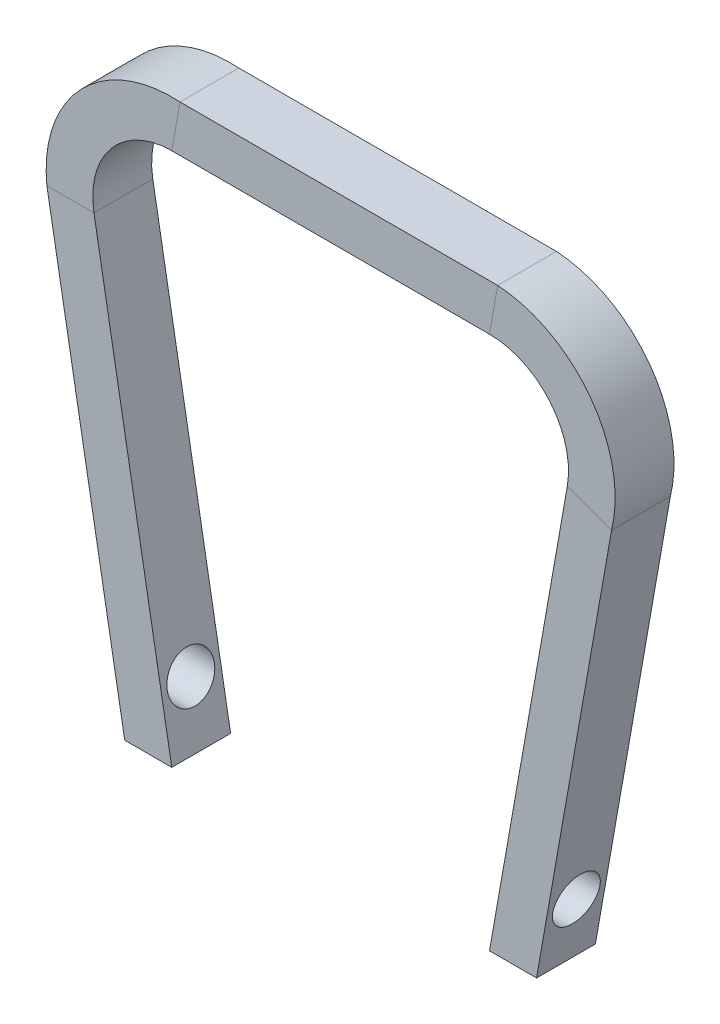
ISO-10303-21;
HEADER;
FILE_DESCRIPTION(('STEP AP214'),'2;1');
FILE_NAME('part.step','',(''),(''),'','','');
FILE_SCHEMA(('AUTOMOTIVE_DESIGN { 1 0 10303 214 1 1 1 1 }'));
ENDSEC;
DATA;
#1=APPLICATION_CONTEXT('core data for automotive mechanical design processes');
#2=APPLICATION_PROTOCOL_DEFINITION('international standard','automotive_design',2000,#1);
#3=PRODUCT_CONTEXT('',#1,'mechanical');
#4=PRODUCT('Part','Part','',(#3));
#5=PRODUCT_RELATED_PRODUCT_CATEGORY('part','',(#4));
#6=PRODUCT_DEFINITION_FORMATION('','',#4);
#7=PRODUCT_DEFINITION_CONTEXT('part definition',#1,'design');
#8=PRODUCT_DEFINITION('design','',#6,#7);
#9=PRODUCT_DEFINITION_SHAPE('','',#8);
#10=(LENGTH_UNIT() NAMED_UNIT(*) SI_UNIT(.MILLI.,.METRE.));
#11=(NAMED_UNIT(*) PLANE_ANGLE_UNIT() SI_UNIT($,.RADIAN.));
#12=(NAMED_UNIT(*) SI_UNIT($,.STERADIAN.) SOLID_ANGLE_UNIT());
#13=UNCERTAINTY_MEASURE_WITH_UNIT(LENGTH_MEASURE(1.E-05),#10,'distance_accuracy_value','');
#14=(GEOMETRIC_REPRESENTATION_CONTEXT(3) GLOBAL_UNCERTAINTY_ASSIGNED_CONTEXT((#13)) GLOBAL_UNIT_ASSIGNED_CONTEXT((#10,
#11,#12)) REPRESENTATION_CONTEXT('',''));
#15=CARTESIAN_POINT('',(0.,0.,0.));
#16=DIRECTION('',(0.,0.,1.));
#17=DIRECTION('',(1.,0.,0.));
#18=AXIS2_PLACEMENT_3D('',#15,#16,#17);
#19=CARTESIAN_POINT('',(78.1272770271848,-3.47492465618881,-6.35));
#20=DIRECTION('',(0.,0.,1.));
#21=DIRECTION('',(1.,0.,0.));
#22=AXIS2_PLACEMENT_3D('',#19,#20,#21);
#23=PLANE('',#22);
#24=DIRECTION('',(-1.,0.,0.));
#25=VECTOR('',#24,1.);
#26=CARTESIAN_POINT('',(68.58,0.,-6.35));
#27=LINE('',#26,#25);
#28=CARTESIAN_POINT('',(78.74,0.,-6.35));
#29=VERTEX_POINT('',#28);
#30=CARTESIAN_POINT('',(68.58,0.,-6.35));
#31=VERTEX_POINT('',#30);
#32=EDGE_CURVE('E130',#29,#31,#27,.T.);
#33=ORIENTED_EDGE('',*,*,#32,.T.);
#34=DIRECTION('',(0.173648177666931,0.984807753012208,0.));
#35=VECTOR('',#34,1.);
#36=CARTESIAN_POINT('',(68.58,0.,-6.35));
#37=LINE('',#36,#35);
#38=CARTESIAN_POINT('',(85.3751449124814,95.25,-6.35));
#39=VERTEX_POINT('',#38);
#40=EDGE_CURVE('E155',#31,#39,#37,.T.);
#41=ORIENTED_EDGE('',*,*,#40,.T.);
#42=DIRECTION('',(0.939692620785908,-0.342020143325671,0.));
#43=VECTOR('',#42,1.);
#44=CARTESIAN_POINT('',(94.9224219396662,91.7750753438112,-6.35));
#45=LINE('',#44,#43);
#46=CARTESIAN_POINT('',(94.9224219396662,91.7750753438112,-6.35));
#47=VERTEX_POINT('',#46);
#48=EDGE_CURVE('E151',#39,#47,#45,.T.);
#49=ORIENTED_EDGE('',*,*,#48,.T.);
#50=DIRECTION('',(0.173648177666931,0.984807753012208,0.));
#51=VECTOR('',#50,1.);
#52=CARTESIAN_POINT('',(78.1272770271848,-3.47492465618881,-6.35));
#53=LINE('',#52,#51);
#54=EDGE_CURVE('E144',#29,#47,#53,.T.);
#55=ORIENTED_EDGE('',*,*,#54,.F.);
#56=EDGE_LOOP('',(#33,#41,#49,#55));
#57=FACE_BOUND('',#56,.T.);
#58=ADVANCED_FACE('F42',(#57),#23,.F.);
#59=CARTESIAN_POINT('',(78.1272770271848,-3.47492465618881,6.35));
#60=DIRECTION('',(-0.984807753012208,0.173648177666931,0.));
#61=DIRECTION('',(-0.173648177666931,-0.984807753012208,0.));
#62=AXIS2_PLACEMENT_3D('',#59,#60,#61);
#63=PLANE('',#62);
#64=CARTESIAN_POINT('',(80.9793526549975,12.7,0.));
#65=DIRECTION('',(-0.984807753012208,0.173648177666931,0.));
#66=DIRECTION('',(0.173648177666931,0.984807753012208,0.));
#67=AXIS2_PLACEMENT_3D('',#64,#65,#66);
#68=ELLIPSE('',#67,5.17146675356125,5.092900553352);
#69=CARTESIAN_POINT('',(81.8773684326185,17.792900553352,0.));
#70=VERTEX_POINT('',#69);
#71=EDGE_CURVE('E147',#70,#70,#68,.T.);
#72=ORIENTED_EDGE('',*,*,#71,.T.);
#73=EDGE_LOOP('',(#72));
#74=FACE_BOUND('',#73,.T.);
#75=DIRECTION('',(0.,0.,-1.));
#76=VECTOR('',#75,1.);
#77=CARTESIAN_POINT('',(78.74,0.,6.35));
#78=LINE('',#77,#76);
#79=CARTESIAN_POINT('',(78.74,0.,6.35));
#80=VERTEX_POINT('',#79);
#81=EDGE_CURVE('E58',#80,#29,#78,.T.);
#82=ORIENTED_EDGE('',*,*,#81,.T.);
#83=ORIENTED_EDGE('',*,*,#54,.T.);
#84=DIRECTION('',(0.,0.,1.));
#85=VECTOR('',#84,1.);
#86=CARTESIAN_POINT('',(94.9224219396662,91.7750753438112,6.35));
#87=LINE('',#86,#85);
#88=CARTESIAN_POINT('',(94.9224219396662,91.7750753438112,6.35));
#89=VERTEX_POINT('',#88);
#90=EDGE_CURVE('E152',#47,#89,#87,.T.);
#91=ORIENTED_EDGE('',*,*,#90,.T.);
#92=DIRECTION('',(0.173648177666931,0.984807753012208,0.));
#93=VECTOR('',#92,1.);
#94=CARTESIAN_POINT('',(78.1272770271848,-3.47492465618881,6.35));
#95=LINE('',#94,#93);
#96=EDGE_CURVE('E146',#80,#89,#95,.T.);
#97=ORIENTED_EDGE('',*,*,#96,.F.);
#98=EDGE_LOOP('',(#82,#83,#91,#97));
#99=FACE_BOUND('',#98,.T.);
#100=ADVANCED_FACE('F142',(#74,#99),#63,.F.);
#101=CARTESIAN_POINT('',(78.1272770271848,-3.47492465618881,6.35));
#102=DIRECTION('',(0.,0.,-1.));
#103=DIRECTION('',(-1.,0.,0.));
#104=AXIS2_PLACEMENT_3D('',#101,#102,#103);
#105=PLANE('',#104);
#106=DIRECTION('',(1.,0.,0.));
#107=VECTOR('',#106,1.);
#108=CARTESIAN_POINT('',(68.58,0.,6.35));
#109=LINE('',#108,#107);
#110=CARTESIAN_POINT('',(68.58,0.,6.35));
#111=VERTEX_POINT('',#110);
#112=EDGE_CURVE('E138',#111,#80,#109,.T.);
#113=ORIENTED_EDGE('',*,*,#112,.T.);
#114=ORIENTED_EDGE('',*,*,#96,.T.);
#115=DIRECTION('',(-0.939692620785908,0.342020143325671,0.));
#116=VECTOR('',#115,1.);
#117=CARTESIAN_POINT('',(94.9224219396662,91.7750753438112,6.35));
#118=LINE('',#117,#116);
#119=CARTESIAN_POINT('',(85.3751449124814,95.25,6.35));
#120=VERTEX_POINT('',#119);
#121=EDGE_CURVE('E189',#89,#120,#118,.T.);
#122=ORIENTED_EDGE('',*,*,#121,.T.);
#123=DIRECTION('',(0.173648177666931,0.984807753012208,0.));
#124=VECTOR('',#123,1.);
#125=CARTESIAN_POINT('',(68.58,0.,6.35));
#126=LINE('',#125,#124);
#127=EDGE_CURVE('E253',#111,#120,#126,.T.);
#128=ORIENTED_EDGE('',*,*,#127,.F.);
#129=EDGE_LOOP('',(#113,#114,#122,#128));
#130=FACE_BOUND('',#129,.T.);
#131=ADVANCED_FACE('F296',(#130),#105,.F.);
#132=CARTESIAN_POINT('',(0.,0.,0.));
#133=DIRECTION('',(0.,-1.,0.));
#134=DIRECTION('',(0.,0.,-1.));
#135=AXIS2_PLACEMENT_3D('',#132,#133,#134);
#136=PLANE('',#135);
#137=DIRECTION('',(0.,0.,-1.));
#138=VECTOR('',#137,1.);
#139=CARTESIAN_POINT('',(0.,0.,6.35));
#140=LINE('',#139,#138);
#141=CARTESIAN_POINT('',(0.,0.,6.35));
#142=VERTEX_POINT('',#141);
#143=CARTESIAN_POINT('',(0.,0.,-6.35));
#144=VERTEX_POINT('',#143);
#145=EDGE_CURVE('E226',#142,#144,#140,.T.);
#146=ORIENTED_EDGE('',*,*,#145,.F.);
#147=DIRECTION('',(1.,0.,0.));
#148=VECTOR('',#147,1.);
#149=CARTESIAN_POINT('',(-10.16,0.,6.35));
#150=LINE('',#149,#148);
#151=CARTESIAN_POINT('',(-10.16,0.,6.35));
#152=VERTEX_POINT('',#151);
#153=EDGE_CURVE('E11',#152,#142,#150,.T.);
#154=ORIENTED_EDGE('',*,*,#153,.F.);
#155=DIRECTION('',(0.,0.,1.));
#156=VECTOR('',#155,1.);
#157=CARTESIAN_POINT('',(-10.16,0.,6.35));
#158=LINE('',#157,#156);
#159=CARTESIAN_POINT('',(-10.16,0.,-6.35));
#160=VERTEX_POINT('',#159);
#161=EDGE_CURVE('E66',#160,#152,#158,.T.);
#162=ORIENTED_EDGE('',*,*,#161,.F.);
#163=DIRECTION('',(-1.,0.,0.));
#164=VECTOR('',#163,1.);
#165=CARTESIAN_POINT('',(-10.16,0.,-6.35));
#166=LINE('',#165,#164);
#167=EDGE_CURVE('E183',#144,#160,#166,.T.);
#168=ORIENTED_EDGE('',*,*,#167,.F.);
#169=EDGE_LOOP('',(#146,#154,#162,#168));
#170=FACE_BOUND('',#169,.T.);
#171=ADVANCED_FACE('F44',(#170),#136,.T.);
#172=CARTESIAN_POINT('',(68.58,0.,6.35));
#173=DIRECTION('',(0.984807753012208,-0.173648177666931,0.));
#174=DIRECTION('',(0.173648177666931,0.984807753012208,0.));
#175=AXIS2_PLACEMENT_3D('',#172,#173,#174);
#176=PLANE('',#175);
#177=CARTESIAN_POINT('',(70.8193526549975,12.7,0.));
#178=DIRECTION('',(0.984807753012208,-0.173648177666931,0.));
#179=DIRECTION('',(0.173648177666931,0.984807753012208,0.));
#180=AXIS2_PLACEMENT_3D('',#177,#178,#179);
#181=ELLIPSE('',#180,5.17146675356125,5.092900553352);
#182=CARTESIAN_POINT('',(71.7173684326185,17.792900553352,0.));
#183=VERTEX_POINT('',#182);
#184=EDGE_CURVE('E264',#183,#183,#181,.T.);
#185=ORIENTED_EDGE('',*,*,#184,.T.);
#186=EDGE_LOOP('',(#185));
#187=FACE_BOUND('',#186,.T.);
#188=ORIENTED_EDGE('',*,*,#40,.F.);
#189=DIRECTION('',(0.,0.,-1.));
#190=VECTOR('',#189,1.);
#191=CARTESIAN_POINT('',(68.58,0.,6.35));
#192=LINE('',#191,#190);
#193=EDGE_CURVE('E133',#111,#31,#192,.T.);
#194=ORIENTED_EDGE('',*,*,#193,.F.);
#195=ORIENTED_EDGE('',*,*,#127,.T.);
#196=DIRECTION('',(0.,0.,-1.));
#197=VECTOR('',#196,1.);
#198=CARTESIAN_POINT('',(85.3751449124814,95.25,6.35));
#199=LINE('',#198,#197);
#200=EDGE_CURVE('E256',#120,#39,#199,.T.);
#201=ORIENTED_EDGE('',*,*,#200,.T.);
#202=EDGE_LOOP('',(#188,#194,#195,#201));
#203=FACE_BOUND('',#202,.T.);
#204=ADVANCED_FACE('F372',(#187,#203),#176,.F.);
#205=CARTESIAN_POINT('',(68.58,98.211437192979,0.));
#206=DIRECTION('',(0.,0.,1.));
#207=DIRECTION('',(1.,0.,0.));
#208=AXIS2_PLACEMENT_3D('',#205,#206,#207);
#209=CYLINDRICAL_SURFACE('',#208,17.0542370946111);
#210=CARTESIAN_POINT('',(68.58,98.211437192979,-6.35));
#211=DIRECTION('',(0.,0.,1.));
#212=DIRECTION('',(0.984807753012208,-0.17364817766693,0.));
#213=AXIS2_PLACEMENT_3D('',#210,#211,#212);
#214=CIRCLE('',#213,17.0542370946111);
#215=CARTESIAN_POINT('',(68.58,115.26567428759,-6.35));
#216=VERTEX_POINT('',#215);
#217=EDGE_CURVE('E163',#39,#216,#214,.T.);
#218=ORIENTED_EDGE('',*,*,#217,.F.);
#219=ORIENTED_EDGE('',*,*,#200,.F.);
#220=CARTESIAN_POINT('',(68.58,98.211437192979,6.35));
#221=DIRECTION('',(0.,0.,1.));
#222=DIRECTION('',(0.984807753012208,-0.17364817766693,0.));
#223=AXIS2_PLACEMENT_3D('',#220,#221,#222);
#224=CIRCLE('',#223,17.0542370946111);
#225=CARTESIAN_POINT('',(68.58,115.26567428759,6.35));
#226=VERTEX_POINT('',#225);
#227=EDGE_CURVE('E213',#120,#226,#224,.T.);
#228=ORIENTED_EDGE('',*,*,#227,.T.);
#229=DIRECTION('',(0.,0.,-1.));
#230=VECTOR('',#229,1.);
#231=CARTESIAN_POINT('',(68.58,115.26567428759,6.35));
#232=LINE('',#231,#230);
#233=EDGE_CURVE('E248',#226,#216,#232,.T.);
#234=ORIENTED_EDGE('',*,*,#233,.T.);
#235=EDGE_LOOP('',(#218,#219,#228,#234));
#236=FACE_BOUND('',#235,.T.);
#237=ADVANCED_FACE('F307',(#236),#209,.F.);
#238=CARTESIAN_POINT('',(94.9224219396662,91.7750753438112,-6.35));
#239=DIRECTION('',(0.,0.,1.));
#240=DIRECTION('',(1.,0.,0.));
#241=AXIS2_PLACEMENT_3D('',#238,#239,#240);
#242=PLANE('',#241);
#243=CARTESIAN_POINT('',(68.58,98.211437192979,-6.35));
#244=DIRECTION('',(0.,0.,1.));
#245=DIRECTION('',(0.971423642022983,-0.237352286104015,0.));
#246=AXIS2_PLACEMENT_3D('',#243,#244,#245);
#247=CIRCLE('',#246,27.1173366594293);
#248=CARTESIAN_POINT('',(70.344265485096,125.271321058194,-6.35));
#249=VERTEX_POINT('',#248);
#250=EDGE_CURVE('E162',#47,#249,#247,.T.);
#251=ORIENTED_EDGE('',*,*,#250,.F.);
#252=ORIENTED_EDGE('',*,*,#48,.F.);
#253=ORIENTED_EDGE('',*,*,#217,.T.);
#254=DIRECTION('',(0.173648177666931,0.984807753012208,0.));
#255=VECTOR('',#254,1.);
#256=CARTESIAN_POINT('',(70.344265485096,125.271321058194,-6.35));
#257=LINE('',#256,#255);
#258=EDGE_CURVE('E159',#216,#249,#257,.T.);
#259=ORIENTED_EDGE('',*,*,#258,.T.);
#260=EDGE_LOOP('',(#251,#252,#253,#259));
#261=FACE_BOUND('',#260,.T.);
#262=ADVANCED_FACE('F303',(#261),#242,.F.);
#263=CARTESIAN_POINT('',(68.58,98.211437192979,0.));
#264=DIRECTION('',(0.,0.,1.));
#265=DIRECTION('',(1.,0.,0.));
#266=AXIS2_PLACEMENT_3D('',#263,#264,#265);
#267=CYLINDRICAL_SURFACE('',#266,27.1173366594293);
#268=CARTESIAN_POINT('',(68.58,98.211437192979,6.35));
#269=DIRECTION('',(0.,0.,1.));
#270=DIRECTION('',(0.971423642022983,-0.237352286104015,0.));
#271=AXIS2_PLACEMENT_3D('',#268,#269,#270);
#272=CIRCLE('',#271,27.1173366594293);
#273=CARTESIAN_POINT('',(70.344265485096,125.271321058194,6.35));
#274=VERTEX_POINT('',#273);
#275=EDGE_CURVE('E192',#89,#274,#272,.T.);
#276=ORIENTED_EDGE('',*,*,#275,.F.);
#277=ORIENTED_EDGE('',*,*,#90,.F.);
#278=ORIENTED_EDGE('',*,*,#250,.T.);
#279=DIRECTION('',(0.,0.,1.));
#280=VECTOR('',#279,1.);
#281=CARTESIAN_POINT('',(70.344265485096,125.271321058194,6.35));
#282=LINE('',#281,#280);
#283=EDGE_CURVE('E166',#249,#274,#282,.T.);
#284=ORIENTED_EDGE('',*,*,#283,.T.);
#285=EDGE_LOOP('',(#276,#277,#278,#284));
#286=FACE_BOUND('',#285,.T.);
#287=ADVANCED_FACE('F306',(#286),#267,.T.);
#288=CARTESIAN_POINT('',(94.9224219396662,91.7750753438112,6.35));
#289=DIRECTION('',(0.,0.,-1.));
#290=DIRECTION('',(-1.,0.,0.));
#291=AXIS2_PLACEMENT_3D('',#288,#289,#290);
#292=PLANE('',#291);
#293=DIRECTION('',(-0.173648177666931,-0.984807753012208,0.));
#294=VECTOR('',#293,1.);
#295=CARTESIAN_POINT('',(70.344265485096,125.271321058194,6.35));
#296=LINE('',#295,#294);
#297=EDGE_CURVE('E195',#274,#226,#296,.T.);
#298=ORIENTED_EDGE('',*,*,#297,.T.);
#299=ORIENTED_EDGE('',*,*,#227,.F.);
#300=ORIENTED_EDGE('',*,*,#121,.F.);
#301=ORIENTED_EDGE('',*,*,#275,.T.);
#302=EDGE_LOOP('',(#298,#299,#300,#301));
#303=FACE_BOUND('',#302,.T.);
#304=ADVANCED_FACE('F327',(#303),#292,.F.);
#305=CARTESIAN_POINT('',(68.58,115.26567428759,6.35));
#306=DIRECTION('',(0.,1.,0.));
#307=DIRECTION('',(0.,0.,1.));
#308=AXIS2_PLACEMENT_3D('',#305,#306,#307);
#309=PLANE('',#308);
#310=DIRECTION('',(-1.,0.,0.));
#311=VECTOR('',#310,1.);
#312=CARTESIAN_POINT('',(68.58,115.26567428759,-6.35));
#313=LINE('',#312,#311);
#314=CARTESIAN_POINT('',(0.,115.26567428759,-6.35));
#315=VERTEX_POINT('',#314);
#316=EDGE_CURVE('E171',#216,#315,#313,.T.);
#317=ORIENTED_EDGE('',*,*,#316,.F.);
#318=ORIENTED_EDGE('',*,*,#233,.F.);
#319=DIRECTION('',(-1.,0.,0.));
#320=VECTOR('',#319,1.);
#321=CARTESIAN_POINT('',(68.58,115.26567428759,6.35));
#322=LINE('',#321,#320);
#323=CARTESIAN_POINT('',(0.,115.26567428759,6.35));
#324=VERTEX_POINT('',#323);
#325=EDGE_CURVE('E216',#226,#324,#322,.T.);
#326=ORIENTED_EDGE('',*,*,#325,.T.);
#327=DIRECTION('',(0.,0.,-1.));
#328=VECTOR('',#327,1.);
#329=CARTESIAN_POINT('',(0.,115.26567428759,6.35));
#330=LINE('',#329,#328);
#331=EDGE_CURVE('E241',#324,#315,#330,.T.);
#332=ORIENTED_EDGE('',*,*,#331,.T.);
#333=EDGE_LOOP('',(#317,#318,#326,#332));
#334=FACE_BOUND('',#333,.T.);
#335=ADVANCED_FACE('F313',(#334),#309,.F.);
#336=CARTESIAN_POINT('',(70.344265485096,125.271321058194,-6.35));
#337=DIRECTION('',(0.,0.,1.));
#338=DIRECTION('',(0.,-1.,0.));
#339=AXIS2_PLACEMENT_3D('',#336,#337,#338);
#340=PLANE('',#339);
#341=DIRECTION('',(-1.,0.,0.));
#342=VECTOR('',#341,1.);
#343=CARTESIAN_POINT('',(70.344265485096,125.271321058194,-6.35));
#344=LINE('',#343,#342);
#345=CARTESIAN_POINT('',(1.76426548509602,125.271321058194,-6.35));
#346=VERTEX_POINT('',#345);
#347=EDGE_CURVE('E170',#249,#346,#344,.T.);
#348=ORIENTED_EDGE('',*,*,#347,.F.);
#349=ORIENTED_EDGE('',*,*,#258,.F.);
#350=ORIENTED_EDGE('',*,*,#316,.T.);
#351=DIRECTION('',(0.173648177666931,0.984807753012208,0.));
#352=VECTOR('',#351,1.);
#353=CARTESIAN_POINT('',(1.76426548509602,125.271321058194,-6.35));
#354=LINE('',#353,#352);
#355=EDGE_CURVE('E167',#315,#346,#354,.T.);
#356=ORIENTED_EDGE('',*,*,#355,.T.);
#357=EDGE_LOOP('',(#348,#349,#350,#356));
#358=FACE_BOUND('',#357,.T.);
#359=ADVANCED_FACE('F309',(#358),#340,.F.);
#360=CARTESIAN_POINT('',(70.344265485096,125.271321058194,6.35));
#361=DIRECTION('',(0.,-1.,0.));
#362=DIRECTION('',(0.,0.,-1.));
#363=AXIS2_PLACEMENT_3D('',#360,#361,#362);
#364=PLANE('',#363);
#365=DIRECTION('',(-1.,0.,0.));
#366=VECTOR('',#365,1.);
#367=CARTESIAN_POINT('',(70.344265485096,125.271321058194,6.35));
#368=LINE('',#367,#366);
#369=CARTESIAN_POINT('',(1.76426548509602,125.271321058194,6.35));
#370=VERTEX_POINT('',#369);
#371=EDGE_CURVE('E198',#274,#370,#368,.T.);
#372=ORIENTED_EDGE('',*,*,#371,.F.);
#373=ORIENTED_EDGE('',*,*,#283,.F.);
#374=ORIENTED_EDGE('',*,*,#347,.T.);
#375=DIRECTION('',(0.,0.,1.));
#376=VECTOR('',#375,1.);
#377=CARTESIAN_POINT('',(1.76426548509602,125.271321058194,6.35));
#378=LINE('',#377,#376);
#379=EDGE_CURVE('E174',#346,#370,#378,.T.);
#380=ORIENTED_EDGE('',*,*,#379,.T.);
#381=EDGE_LOOP('',(#372,#373,#374,#380));
#382=FACE_BOUND('',#381,.T.);
#383=ADVANCED_FACE('F312',(#382),#364,.F.);
#384=CARTESIAN_POINT('',(70.344265485096,125.271321058194,6.35));
#385=DIRECTION('',(0.,0.,-1.));
#386=DIRECTION('',(0.,1.,0.));
#387=AXIS2_PLACEMENT_3D('',#384,#385,#386);
#388=PLANE('',#387);
#389=DIRECTION('',(-0.173648177666931,-0.984807753012208,0.));
#390=VECTOR('',#389,1.);
#391=CARTESIAN_POINT('',(1.76426548509602,125.271321058194,6.35));
#392=LINE('',#391,#390);
#393=EDGE_CURVE('E201',#370,#324,#392,.T.);
#394=ORIENTED_EDGE('',*,*,#393,.T.);
#395=ORIENTED_EDGE('',*,*,#325,.F.);
#396=ORIENTED_EDGE('',*,*,#297,.F.);
#397=ORIENTED_EDGE('',*,*,#371,.T.);
#398=EDGE_LOOP('',(#394,#395,#396,#397));
#399=FACE_BOUND('',#398,.T.);
#400=ADVANCED_FACE('F331',(#399),#388,.F.);
#401=CARTESIAN_POINT('',(0.,98.211437192979,0.));
#402=DIRECTION('',(0.,0.,1.));
#403=DIRECTION('',(1.,0.,0.));
#404=AXIS2_PLACEMENT_3D('',#401,#402,#403);
#405=CYLINDRICAL_SURFACE('',#404,17.0542370946111);
#406=CARTESIAN_POINT('',(0.,98.211437192979,-6.35));
#407=DIRECTION('',(0.,0.,1.));
#408=DIRECTION('',(0.,1.,0.));
#409=AXIS2_PLACEMENT_3D('',#406,#407,#408);
#410=CIRCLE('',#409,17.0542370946111);
#411=CARTESIAN_POINT('',(-16.7951449124814,95.25,-6.35));
#412=VERTEX_POINT('',#411);
#413=EDGE_CURVE('E179',#315,#412,#410,.T.);
#414=ORIENTED_EDGE('',*,*,#413,.F.);
#415=ORIENTED_EDGE('',*,*,#331,.F.);
#416=CARTESIAN_POINT('',(0.,98.211437192979,6.35));
#417=DIRECTION('',(0.,0.,1.));
#418=DIRECTION('',(0.,1.,0.));
#419=AXIS2_PLACEMENT_3D('',#416,#417,#418);
#420=CIRCLE('',#419,17.0542370946111);
#421=CARTESIAN_POINT('',(-16.7951449124814,95.25,6.35));
#422=VERTEX_POINT('',#421);
#423=EDGE_CURVE('E219',#324,#422,#420,.T.);
#424=ORIENTED_EDGE('',*,*,#423,.T.);
#425=DIRECTION('',(0.,0.,-1.));
#426=VECTOR('',#425,1.);
#427=CARTESIAN_POINT('',(-16.7951449124814,95.25,6.35));
#428=LINE('',#427,#426);
#429=EDGE_CURVE('E234',#422,#412,#428,.T.);
#430=ORIENTED_EDGE('',*,*,#429,.T.);
#431=EDGE_LOOP('',(#414,#415,#424,#430));
#432=FACE_BOUND('',#431,.T.);
#433=ADVANCED_FACE('F319',(#432),#405,.F.);
#434=CARTESIAN_POINT('',(1.76426548509603,125.271321058194,-6.35));
#435=DIRECTION('',(0.,0.,1.));
#436=DIRECTION('',(1.,0.,0.));
#437=AXIS2_PLACEMENT_3D('',#434,#435,#436);
#438=PLANE('',#437);
#439=CARTESIAN_POINT('',(0.,98.211437192979,-6.35));
#440=DIRECTION('',(0.,0.,1.));
#441=DIRECTION('',(0.0650604263705429,0.997881326070632,0.));
#442=AXIS2_PLACEMENT_3D('',#439,#440,#441);
#443=CIRCLE('',#442,27.1173366594294);
#444=CARTESIAN_POINT('',(-26.9551449124814,95.25,-6.35));
#445=VERTEX_POINT('',#444);
#446=EDGE_CURVE('E178',#346,#445,#443,.T.);
#447=ORIENTED_EDGE('',*,*,#446,.F.);
#448=ORIENTED_EDGE('',*,*,#355,.F.);
#449=ORIENTED_EDGE('',*,*,#413,.T.);
#450=DIRECTION('',(-1.,0.,0.));
#451=VECTOR('',#450,1.);
#452=CARTESIAN_POINT('',(-26.9551449124814,95.25,-6.35));
#453=LINE('',#452,#451);
#454=EDGE_CURVE('E175',#412,#445,#453,.T.);
#455=ORIENTED_EDGE('',*,*,#454,.T.);
#456=EDGE_LOOP('',(#447,#448,#449,#455));
#457=FACE_BOUND('',#456,.T.);
#458=ADVANCED_FACE('F315',(#457),#438,.F.);
#459=CARTESIAN_POINT('',(0.,98.211437192979,0.));
#460=DIRECTION('',(0.,0.,1.));
#461=DIRECTION('',(1.,0.,0.));
#462=AXIS2_PLACEMENT_3D('',#459,#460,#461);
#463=CYLINDRICAL_SURFACE('',#462,27.1173366594294);
#464=CARTESIAN_POINT('',(0.,98.211437192979,6.35));
#465=DIRECTION('',(0.,0.,1.));
#466=DIRECTION('',(0.0650604263705429,0.997881326070632,0.));
#467=AXIS2_PLACEMENT_3D('',#464,#465,#466);
#468=CIRCLE('',#467,27.1173366594294);
#469=CARTESIAN_POINT('',(-26.9551449124814,95.25,6.35));
#470=VERTEX_POINT('',#469);
#471=EDGE_CURVE('E204',#370,#470,#468,.T.);
#472=ORIENTED_EDGE('',*,*,#471,.F.);
#473=ORIENTED_EDGE('',*,*,#379,.F.);
#474=ORIENTED_EDGE('',*,*,#446,.T.);
#475=DIRECTION('',(0.,0.,1.));
#476=VECTOR('',#475,1.);
#477=CARTESIAN_POINT('',(-26.9551449124814,95.25,6.35));
#478=LINE('',#477,#476);
#479=EDGE_CURVE('E182',#445,#470,#478,.T.);
#480=ORIENTED_EDGE('',*,*,#479,.T.);
#481=EDGE_LOOP('',(#472,#473,#474,#480));
#482=FACE_BOUND('',#481,.T.);
#483=ADVANCED_FACE('F318',(#482),#463,.T.);
#484=CARTESIAN_POINT('',(1.76426548509603,125.271321058194,6.35));
#485=DIRECTION('',(0.,0.,-1.));
#486=DIRECTION('',(-1.,0.,0.));
#487=AXIS2_PLACEMENT_3D('',#484,#485,#486);
#488=PLANE('',#487);
#489=DIRECTION('',(1.,0.,0.));
#490=VECTOR('',#489,1.);
#491=CARTESIAN_POINT('',(-26.9551449124814,95.25,6.35));
#492=LINE('',#491,#490);
#493=EDGE_CURVE('E207',#470,#422,#492,.T.);
#494=ORIENTED_EDGE('',*,*,#493,.T.);
#495=ORIENTED_EDGE('',*,*,#423,.F.);
#496=ORIENTED_EDGE('',*,*,#393,.F.);
#497=ORIENTED_EDGE('',*,*,#471,.T.);
#498=EDGE_LOOP('',(#494,#495,#496,#497));
#499=FACE_BOUND('',#498,.T.);
#500=ADVANCED_FACE('F335',(#499),#488,.F.);
#501=CARTESIAN_POINT('',(-16.7951449124814,95.25,6.35));
#502=DIRECTION('',(-0.984807753012208,-0.173648177666931,0.));
#503=DIRECTION('',(0.173648177666931,-0.984807753012208,0.));
#504=AXIS2_PLACEMENT_3D('',#501,#502,#503);
#505=PLANE('',#504);
#506=CARTESIAN_POINT('',(-2.23935265499751,12.7,0.));
#507=DIRECTION('',(-0.984807753012208,-0.173648177666931,0.));
#508=DIRECTION('',(0.173648177666931,-0.984807753012208,0.));
#509=AXIS2_PLACEMENT_3D('',#506,#507,#508);
#510=ELLIPSE('',#509,5.17146675356125,5.092900553352);
#511=CARTESIAN_POINT('',(-1.34133687737648,7.607099446648,0.));
#512=VERTEX_POINT('',#511);
#513=EDGE_CURVE('E267',#512,#512,#510,.T.);
#514=ORIENTED_EDGE('',*,*,#513,.T.);
#515=EDGE_LOOP('',(#514));
#516=FACE_BOUND('',#515,.T.);
#517=DIRECTION('',(0.173648177666931,-0.984807753012208,0.));
#518=VECTOR('',#517,1.);
#519=CARTESIAN_POINT('',(-16.7951449124814,95.25,-6.35));
#520=LINE('',#519,#518);
#521=EDGE_CURVE('E186',#412,#144,#520,.T.);
#522=ORIENTED_EDGE('',*,*,#521,.F.);
#523=ORIENTED_EDGE('',*,*,#429,.F.);
#524=DIRECTION('',(0.173648177666931,-0.984807753012208,0.));
#525=VECTOR('',#524,1.);
#526=CARTESIAN_POINT('',(-16.7951449124814,95.25,6.35));
#527=LINE('',#526,#525);
#528=EDGE_CURVE('E221',#422,#142,#527,.T.);
#529=ORIENTED_EDGE('',*,*,#528,.T.);
#530=ORIENTED_EDGE('',*,*,#145,.T.);
#531=EDGE_LOOP('',(#522,#523,#529,#530));
#532=FACE_BOUND('',#531,.T.);
#533=ADVANCED_FACE('F301',(#516,#532),#505,.F.);
#534=CARTESIAN_POINT('',(-26.9551449124814,95.25,-6.35));
#535=DIRECTION('',(0.,0.,1.));
#536=DIRECTION('',(1.,0.,0.));
#537=AXIS2_PLACEMENT_3D('',#534,#535,#536);
#538=PLANE('',#537);
#539=DIRECTION('',(0.173648177666931,-0.984807753012208,0.));
#540=VECTOR('',#539,1.);
#541=CARTESIAN_POINT('',(-26.9551449124814,95.25,-6.35));
#542=LINE('',#541,#540);
#543=EDGE_CURVE('E185',#445,#160,#542,.T.);
#544=ORIENTED_EDGE('',*,*,#543,.F.);
#545=ORIENTED_EDGE('',*,*,#454,.F.);
#546=ORIENTED_EDGE('',*,*,#521,.T.);
#547=ORIENTED_EDGE('',*,*,#167,.T.);
#548=EDGE_LOOP('',(#544,#545,#546,#547));
#549=FACE_BOUND('',#548,.T.);
#550=ADVANCED_FACE('F321',(#549),#538,.F.);
#551=CARTESIAN_POINT('',(-26.9551449124814,95.25,6.35));
#552=DIRECTION('',(0.984807753012208,0.173648177666931,0.));
#553=DIRECTION('',(-0.173648177666931,0.984807753012208,0.));
#554=AXIS2_PLACEMENT_3D('',#551,#552,#553);
#555=PLANE('',#554);
#556=CARTESIAN_POINT('',(-12.3993526549975,12.7,0.));
#557=DIRECTION('',(0.984807753012208,0.173648177666931,0.));
#558=DIRECTION('',(0.173648177666931,-0.984807753012208,0.));
#559=AXIS2_PLACEMENT_3D('',#556,#557,#558);
#560=ELLIPSE('',#559,5.17146675356125,5.092900553352);
#561=CARTESIAN_POINT('',(-11.5013368773765,7.607099446648,0.));
#562=VERTEX_POINT('',#561);
#563=EDGE_CURVE('E46',#562,#562,#560,.T.);
#564=ORIENTED_EDGE('',*,*,#563,.T.);
#565=EDGE_LOOP('',(#564));
#566=FACE_BOUND('',#565,.T.);
#567=DIRECTION('',(0.173648177666931,-0.984807753012208,0.));
#568=VECTOR('',#567,1.);
#569=CARTESIAN_POINT('',(-26.9551449124814,95.25,6.35));
#570=LINE('',#569,#568);
#571=EDGE_CURVE('E51',#470,#152,#570,.T.);
#572=ORIENTED_EDGE('',*,*,#571,.F.);
#573=ORIENTED_EDGE('',*,*,#479,.F.);
#574=ORIENTED_EDGE('',*,*,#543,.T.);
#575=ORIENTED_EDGE('',*,*,#161,.T.);
#576=EDGE_LOOP('',(#572,#573,#574,#575));
#577=FACE_BOUND('',#576,.T.);
#578=ADVANCED_FACE('F274',(#566,#577),#555,.F.);
#579=CARTESIAN_POINT('',(-26.9551449124814,95.25,6.35));
#580=DIRECTION('',(0.,0.,-1.));
#581=DIRECTION('',(-1.,0.,0.));
#582=AXIS2_PLACEMENT_3D('',#579,#580,#581);
#583=PLANE('',#582);
#584=ORIENTED_EDGE('',*,*,#153,.T.);
#585=ORIENTED_EDGE('',*,*,#528,.F.);
#586=ORIENTED_EDGE('',*,*,#493,.F.);
#587=ORIENTED_EDGE('',*,*,#571,.T.);
#588=EDGE_LOOP('',(#584,#585,#586,#587));
#589=FACE_BOUND('',#588,.T.);
#590=ADVANCED_FACE('F287',(#589),#583,.F.);
#591=CARTESIAN_POINT('',(0.,0.,0.));
#592=DIRECTION('',(0.,-1.,0.));
#593=DIRECTION('',(0.,0.,-1.));
#594=AXIS2_PLACEMENT_3D('',#591,#592,#593);
#595=PLANE('',#594);
#596=ORIENTED_EDGE('',*,*,#81,.F.);
#597=ORIENTED_EDGE('',*,*,#112,.F.);
#598=ORIENTED_EDGE('',*,*,#193,.T.);
#599=ORIENTED_EDGE('',*,*,#32,.F.);
#600=EDGE_LOOP('',(#596,#597,#598,#599));
#601=FACE_BOUND('',#600,.T.);
#602=ADVANCED_FACE('F131',(#601),#595,.T.);
#603=CARTESIAN_POINT('',(-127.,12.7,0.));
#604=DIRECTION('',(1.,0.,0.));
#605=DIRECTION('',(0.,0.,-1.));
#606=AXIS2_PLACEMENT_3D('',#603,#604,#605);
#607=CYLINDRICAL_SURFACE('',#606,5.092900553352);
#608=ORIENTED_EDGE('',*,*,#563,.F.);
#609=EDGE_LOOP('',(#608));
#610=FACE_BOUND('',#609,.T.);
#611=ORIENTED_EDGE('',*,*,#513,.F.);
#612=EDGE_LOOP('',(#611));
#613=FACE_BOUND('',#612,.T.);
#614=ADVANCED_FACE('F276',(#610,#613),#607,.F.);
#615=ORIENTED_EDGE('',*,*,#184,.F.);
#616=EDGE_LOOP('',(#615));
#617=FACE_BOUND('',#616,.T.);
#618=ORIENTED_EDGE('',*,*,#71,.F.);
#619=EDGE_LOOP('',(#618));
#620=FACE_BOUND('',#619,.T.);
#621=ADVANCED_FACE('F279',(#617,#620),#607,.F.);
#622=CLOSED_SHELL('',(#58,#100,#131,#171,#204,#237,#262,#287,#304,#335,#359,#383,#400,#433,#458,
#483,#500,#533,#550,#578,#590,#602,#614,#621));
#623=MANIFOLD_SOLID_BREP('B2',#622);
#624=ADVANCED_BREP_SHAPE_REPRESENTATION('',(#18,#623),#14);
#625=SHAPE_DEFINITION_REPRESENTATION(#9,#624);
ENDSEC;
END-ISO-10303-21;
